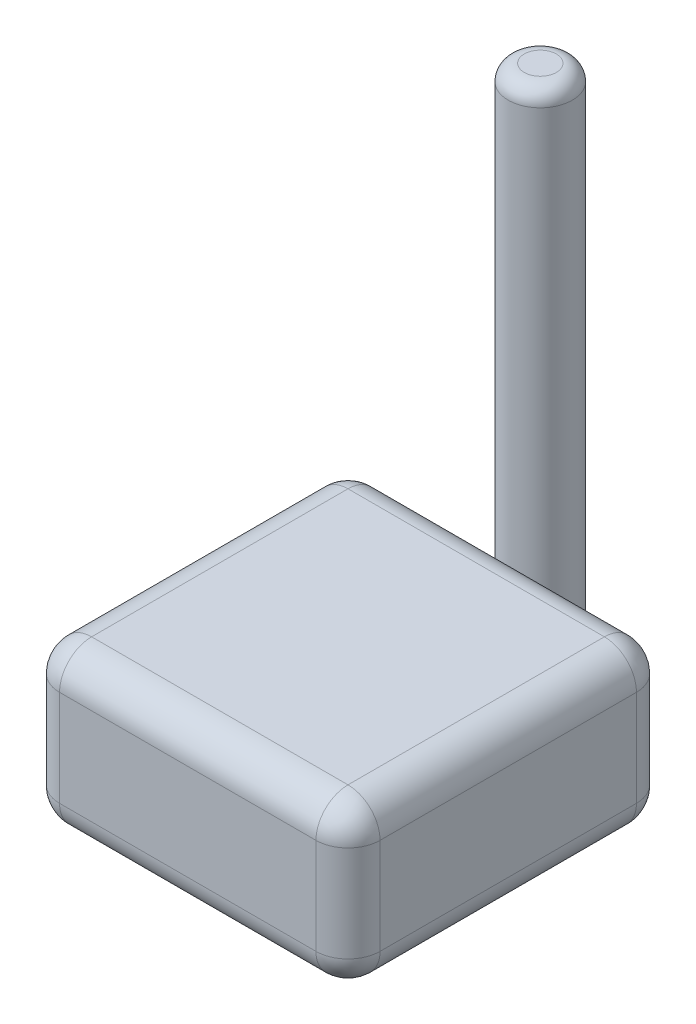
ISO-10303-21;
HEADER;
FILE_DESCRIPTION(('STEP AP214'),'2;1');
FILE_NAME('part.step','',(''),(''),'','','');
FILE_SCHEMA(('AUTOMOTIVE_DESIGN { 1 0 10303 214 1 1 1 1 }'));
ENDSEC;
DATA;
#1=APPLICATION_CONTEXT('core data for automotive mechanical design processes');
#2=APPLICATION_PROTOCOL_DEFINITION('international standard','automotive_design',2000,#1);
#3=PRODUCT_CONTEXT('',#1,'mechanical');
#4=PRODUCT('Part','Part','',(#3));
#5=PRODUCT_RELATED_PRODUCT_CATEGORY('part','',(#4));
#6=PRODUCT_DEFINITION_FORMATION('','',#4);
#7=PRODUCT_DEFINITION_CONTEXT('part definition',#1,'design');
#8=PRODUCT_DEFINITION('design','',#6,#7);
#9=PRODUCT_DEFINITION_SHAPE('','',#8);
#10=(LENGTH_UNIT() NAMED_UNIT(*) SI_UNIT(.MILLI.,.METRE.));
#11=(NAMED_UNIT(*) PLANE_ANGLE_UNIT() SI_UNIT($,.RADIAN.));
#12=(NAMED_UNIT(*) SI_UNIT($,.STERADIAN.) SOLID_ANGLE_UNIT());
#13=UNCERTAINTY_MEASURE_WITH_UNIT(LENGTH_MEASURE(1.E-05),#10,'distance_accuracy_value','');
#14=(GEOMETRIC_REPRESENTATION_CONTEXT(3) GLOBAL_UNCERTAINTY_ASSIGNED_CONTEXT((#13)) GLOBAL_UNIT_ASSIGNED_CONTEXT((#10,
#11,#12)) REPRESENTATION_CONTEXT('',''));
#15=CARTESIAN_POINT('',(0.,0.,0.));
#16=DIRECTION('',(0.,0.,1.));
#17=DIRECTION('',(1.,0.,0.));
#18=AXIS2_PLACEMENT_3D('',#15,#16,#17);
#19=CARTESIAN_POINT('',(-51.4264347774672,45.4042811347466,-12.));
#20=DIRECTION('',(0.,-1.,0.));
#21=DIRECTION('',(1.,0.,0.));
#22=AXIS2_PLACEMENT_3D('',#19,#20,#21);
#23=CYLINDRICAL_SURFACE('',#22,2.);
#24=CARTESIAN_POINT('',(-51.4264347774672,44.4042811347466,-12.));
#25=DIRECTION('',(0.,1.,0.));
#26=DIRECTION('',(-1.,0.,0.));
#27=AXIS2_PLACEMENT_3D('',#24,#25,#26);
#28=CIRCLE('',#27,2.);
#29=CARTESIAN_POINT('',(-53.4264347774672,44.4042811347466,-12.));
#30=VERTEX_POINT('',#29);
#31=EDGE_CURVE('E11',#30,#30,#28,.F.);
#32=ORIENTED_EDGE('',*,*,#31,.T.);
#33=EDGE_LOOP('',(#32));
#34=FACE_BOUND('',#33,.T.);
#35=CARTESIAN_POINT('',(-51.4264347774672,15.4042811347466,-12.));
#36=DIRECTION('',(0.,1.,0.));
#37=DIRECTION('',(-1.,0.,0.));
#38=AXIS2_PLACEMENT_3D('',#35,#36,#37);
#39=CIRCLE('',#38,2.);
#40=CARTESIAN_POINT('',(-53.4264347774672,15.4042811347466,-12.));
#41=VERTEX_POINT('',#40);
#42=EDGE_CURVE('E59',#41,#41,#39,.T.);
#43=ORIENTED_EDGE('',*,*,#42,.T.);
#44=EDGE_LOOP('',(#43));
#45=FACE_BOUND('',#44,.T.);
#46=ADVANCED_FACE('F50',(#34,#45),#23,.T.);
#47=CARTESIAN_POINT('',(-51.4264347774672,45.4042811347466,-12.));
#48=DIRECTION('',(0.,1.,0.));
#49=DIRECTION('',(-1.,0.,0.));
#50=AXIS2_PLACEMENT_3D('',#47,#48,#49);
#51=PLANE('',#50);
#52=CARTESIAN_POINT('',(-51.4264347774672,45.4042811347466,-12.));
#53=DIRECTION('',(0.,1.,0.));
#54=DIRECTION('',(-1.,0.,0.));
#55=AXIS2_PLACEMENT_3D('',#52,#53,#54);
#56=CIRCLE('',#55,1.);
#57=CARTESIAN_POINT('',(-52.4264347774672,45.4042811347466,-12.));
#58=VERTEX_POINT('',#57);
#59=EDGE_CURVE('E53',#58,#58,#56,.T.);
#60=ORIENTED_EDGE('',*,*,#59,.T.);
#61=EDGE_LOOP('',(#60));
#62=FACE_BOUND('',#61,.T.);
#63=ADVANCED_FACE('F70',(#62),#51,.T.);
#64=CARTESIAN_POINT('',(-51.4264347774672,15.4042811347466,-12.));
#65=DIRECTION('',(0.,1.,0.));
#66=DIRECTION('',(-1.,0.,0.));
#67=AXIS2_PLACEMENT_3D('',#64,#65,#66);
#68=PLANE('',#67);
#69=ORIENTED_EDGE('',*,*,#42,.F.);
#70=EDGE_LOOP('',(#69));
#71=FACE_BOUND('',#70,.T.);
#72=ADVANCED_FACE('F69',(#71),#68,.F.);
#73=CARTESIAN_POINT('',(-51.4264347774672,44.4042811347466,-12.));
#74=DIRECTION('',(0.,1.,0.));
#75=DIRECTION('',(-1.,0.,0.));
#76=AXIS2_PLACEMENT_3D('',#73,#74,#75);
#77=TOROIDAL_SURFACE('',#76,1.,1.);
#78=ORIENTED_EDGE('',*,*,#31,.F.);
#79=EDGE_LOOP('',(#78));
#80=FACE_BOUND('',#79,.T.);
#81=ORIENTED_EDGE('',*,*,#59,.F.);
#82=EDGE_LOOP('',(#81));
#83=FACE_BOUND('',#82,.T.);
#84=ADVANCED_FACE('F47',(#80,#83),#77,.T.);
#85=CLOSED_SHELL('',(#46,#63,#72,#84));
#86=MANIFOLD_SOLID_BREP('B2',#85);
#87=CARTESIAN_POINT('',(-41.4264347774672,10.4042811347466,10.));
#88=DIRECTION('',(-1.,0.,0.));
#89=DIRECTION('',(0.,0.,1.));
#90=AXIS2_PLACEMENT_3D('',#87,#88,#89);
#91=PLANE('',#90);
#92=DIRECTION('',(0.,0.,-1.));
#93=VECTOR('',#92,1.);
#94=CARTESIAN_POINT('',(-41.4264347774672,12.4042811347466,10.));
#95=LINE('',#94,#93);
#96=CARTESIAN_POINT('',(-41.4264347774672,12.4042811347466,8.));
#97=VERTEX_POINT('',#96);
#98=CARTESIAN_POINT('',(-41.4264347774672,12.4042811347466,-8.));
#99=VERTEX_POINT('',#98);
#100=EDGE_CURVE('E227',#97,#99,#95,.T.);
#101=ORIENTED_EDGE('',*,*,#100,.T.);
#102=DIRECTION('',(0.,1.,0.));
#103=VECTOR('',#102,1.);
#104=CARTESIAN_POINT('',(-41.4264347774672,20.4042811347466,-8.));
#105=LINE('',#104,#103);
#106=CARTESIAN_POINT('',(-41.4264347774672,18.4042811347466,-8.));
#107=VERTEX_POINT('',#106);
#108=EDGE_CURVE('E315',#99,#107,#105,.T.);
#109=ORIENTED_EDGE('',*,*,#108,.T.);
#110=DIRECTION('',(0.,0.,-1.));
#111=VECTOR('',#110,1.);
#112=CARTESIAN_POINT('',(-41.4264347774672,18.4042811347466,10.));
#113=LINE('',#112,#111);
#114=CARTESIAN_POINT('',(-41.4264347774672,18.4042811347466,8.));
#115=VERTEX_POINT('',#114);
#116=EDGE_CURVE('E307',#107,#115,#113,.F.);
#117=ORIENTED_EDGE('',*,*,#116,.T.);
#118=DIRECTION('',(0.,1.,0.));
#119=VECTOR('',#118,1.);
#120=CARTESIAN_POINT('',(-41.4264347774672,10.4042811347466,8.));
#121=LINE('',#120,#119);
#122=EDGE_CURVE('E310',#115,#97,#121,.F.);
#123=ORIENTED_EDGE('',*,*,#122,.T.);
#124=EDGE_LOOP('',(#101,#109,#117,#123));
#125=FACE_BOUND('',#124,.T.);
#126=ADVANCED_FACE('F103',(#125),#91,.F.);
#127=CARTESIAN_POINT('',(-61.4264347774672,20.4042811347466,10.));
#128=DIRECTION('',(0.,-1.,0.));
#129=DIRECTION('',(0.,0.,-1.));
#130=AXIS2_PLACEMENT_3D('',#127,#128,#129);
#131=PLANE('',#130);
#132=DIRECTION('',(0.,0.,-1.));
#133=VECTOR('',#132,1.);
#134=CARTESIAN_POINT('',(-43.4264347774672,20.4042811347466,10.));
#135=LINE('',#134,#133);
#136=CARTESIAN_POINT('',(-43.4264347774672,20.4042811347466,8.));
#137=VERTEX_POINT('',#136);
#138=CARTESIAN_POINT('',(-43.4264347774672,20.4042811347466,-8.));
#139=VERTEX_POINT('',#138);
#140=EDGE_CURVE('E312',#137,#139,#135,.T.);
#141=ORIENTED_EDGE('',*,*,#140,.T.);
#142=DIRECTION('',(-1.,0.,0.));
#143=VECTOR('',#142,1.);
#144=CARTESIAN_POINT('',(-61.4264347774672,20.4042811347466,-8.));
#145=LINE('',#144,#143);
#146=CARTESIAN_POINT('',(-59.4264347774671,20.4042811347466,-8.));
#147=VERTEX_POINT('',#146);
#148=EDGE_CURVE('E44',#139,#147,#145,.T.);
#149=ORIENTED_EDGE('',*,*,#148,.T.);
#150=DIRECTION('',(0.,0.,-1.));
#151=VECTOR('',#150,1.);
#152=CARTESIAN_POINT('',(-59.4264347774671,20.4042811347466,10.));
#153=LINE('',#152,#151);
#154=CARTESIAN_POINT('',(-59.4264347774671,20.4042811347466,8.));
#155=VERTEX_POINT('',#154);
#156=EDGE_CURVE('E115',#147,#155,#153,.F.);
#157=ORIENTED_EDGE('',*,*,#156,.T.);
#158=DIRECTION('',(-1.,0.,0.));
#159=VECTOR('',#158,1.);
#160=CARTESIAN_POINT('',(-61.4264347774672,20.4042811347466,8.));
#161=LINE('',#160,#159);
#162=EDGE_CURVE('E320',#155,#137,#161,.F.);
#163=ORIENTED_EDGE('',*,*,#162,.T.);
#164=EDGE_LOOP('',(#141,#149,#157,#163));
#165=FACE_BOUND('',#164,.T.);
#166=ADVANCED_FACE('F375',(#165),#131,.F.);
#167=CARTESIAN_POINT('',(-61.4264347774672,10.4042811347466,10.));
#168=DIRECTION('',(1.,0.,0.));
#169=DIRECTION('',(0.,1.,0.));
#170=AXIS2_PLACEMENT_3D('',#167,#168,#169);
#171=PLANE('',#170);
#172=DIRECTION('',(0.,0.,-1.));
#173=VECTOR('',#172,1.);
#174=CARTESIAN_POINT('',(-61.4264347774672,18.4042811347466,10.));
#175=LINE('',#174,#173);
#176=CARTESIAN_POINT('',(-61.4264347774672,18.4042811347466,8.));
#177=VERTEX_POINT('',#176);
#178=CARTESIAN_POINT('',(-61.4264347774672,18.4042811347466,-8.));
#179=VERTEX_POINT('',#178);
#180=EDGE_CURVE('E284',#177,#179,#175,.T.);
#181=ORIENTED_EDGE('',*,*,#180,.T.);
#182=DIRECTION('',(0.,-1.,0.));
#183=VECTOR('',#182,1.);
#184=CARTESIAN_POINT('',(-61.4264347774672,10.4042811347466,-8.));
#185=LINE('',#184,#183);
#186=CARTESIAN_POINT('',(-61.4264347774672,12.4042811347466,-8.));
#187=VERTEX_POINT('',#186);
#188=EDGE_CURVE('E297',#179,#187,#185,.T.);
#189=ORIENTED_EDGE('',*,*,#188,.T.);
#190=DIRECTION('',(0.,0.,-1.));
#191=VECTOR('',#190,1.);
#192=CARTESIAN_POINT('',(-61.4264347774672,12.4042811347466,10.));
#193=LINE('',#192,#191);
#194=CARTESIAN_POINT('',(-61.4264347774672,12.4042811347466,8.));
#195=VERTEX_POINT('',#194);
#196=EDGE_CURVE('E290',#187,#195,#193,.F.);
#197=ORIENTED_EDGE('',*,*,#196,.T.);
#198=DIRECTION('',(0.,-1.,0.));
#199=VECTOR('',#198,1.);
#200=CARTESIAN_POINT('',(-61.4264347774672,10.4042811347466,8.));
#201=LINE('',#200,#199);
#202=EDGE_CURVE('E283',#195,#177,#201,.F.);
#203=ORIENTED_EDGE('',*,*,#202,.T.);
#204=EDGE_LOOP('',(#181,#189,#197,#203));
#205=FACE_BOUND('',#204,.T.);
#206=ADVANCED_FACE('F378',(#205),#171,.F.);
#207=CARTESIAN_POINT('',(-61.4264347774672,10.4042811347466,10.));
#208=DIRECTION('',(0.,1.,0.));
#209=DIRECTION('',(-1.,0.,0.));
#210=AXIS2_PLACEMENT_3D('',#207,#208,#209);
#211=PLANE('',#210);
#212=DIRECTION('',(0.,0.,-1.));
#213=VECTOR('',#212,1.);
#214=CARTESIAN_POINT('',(-59.4264347774672,10.4042811347466,10.));
#215=LINE('',#214,#213);
#216=CARTESIAN_POINT('',(-59.4264347774672,10.4042811347466,8.));
#217=VERTEX_POINT('',#216);
#218=CARTESIAN_POINT('',(-59.4264347774672,10.4042811347466,-8.));
#219=VERTEX_POINT('',#218);
#220=EDGE_CURVE('E202',#217,#219,#215,.T.);
#221=ORIENTED_EDGE('',*,*,#220,.T.);
#222=DIRECTION('',(1.,0.,0.));
#223=VECTOR('',#222,1.);
#224=CARTESIAN_POINT('',(-41.4264347774672,10.4042811347466,-8.));
#225=LINE('',#224,#223);
#226=CARTESIAN_POINT('',(-43.4264347774672,10.4042811347466,-8.));
#227=VERTEX_POINT('',#226);
#228=EDGE_CURVE('E203',#219,#227,#225,.T.);
#229=ORIENTED_EDGE('',*,*,#228,.T.);
#230=DIRECTION('',(0.,0.,-1.));
#231=VECTOR('',#230,1.);
#232=CARTESIAN_POINT('',(-43.4264347774672,10.4042811347466,10.));
#233=LINE('',#232,#231);
#234=CARTESIAN_POINT('',(-43.4264347774672,10.4042811347466,8.));
#235=VERTEX_POINT('',#234);
#236=EDGE_CURVE('E192',#227,#235,#233,.F.);
#237=ORIENTED_EDGE('',*,*,#236,.T.);
#238=DIRECTION('',(1.,0.,0.));
#239=VECTOR('',#238,1.);
#240=CARTESIAN_POINT('',(-61.4264347774672,10.4042811347466,8.));
#241=LINE('',#240,#239);
#242=EDGE_CURVE('E196',#235,#217,#241,.F.);
#243=ORIENTED_EDGE('',*,*,#242,.T.);
#244=EDGE_LOOP('',(#221,#229,#237,#243));
#245=FACE_BOUND('',#244,.T.);
#246=ADVANCED_FACE('F197',(#245),#211,.F.);
#247=CARTESIAN_POINT('',(0.,0.,10.));
#248=DIRECTION('',(0.,0.,-1.));
#249=DIRECTION('',(-1.,0.,0.));
#250=AXIS2_PLACEMENT_3D('',#247,#248,#249);
#251=PLANE('',#250);
#252=DIRECTION('',(-1.,0.,0.));
#253=VECTOR('',#252,1.);
#254=CARTESIAN_POINT('',(0.,18.4042811347466,10.));
#255=LINE('',#254,#253);
#256=CARTESIAN_POINT('',(-43.4264347774672,18.4042811347466,10.));
#257=VERTEX_POINT('',#256);
#258=CARTESIAN_POINT('',(-59.4264347774671,18.4042811347466,10.));
#259=VERTEX_POINT('',#258);
#260=EDGE_CURVE('E300',#257,#259,#255,.T.);
#261=ORIENTED_EDGE('',*,*,#260,.T.);
#262=DIRECTION('',(0.,-1.,0.));
#263=VECTOR('',#262,1.);
#264=CARTESIAN_POINT('',(-59.4264347774672,0.,10.));
#265=LINE('',#264,#263);
#266=CARTESIAN_POINT('',(-59.4264347774672,12.4042811347466,10.));
#267=VERTEX_POINT('',#266);
#268=EDGE_CURVE('E303',#259,#267,#265,.T.);
#269=ORIENTED_EDGE('',*,*,#268,.T.);
#270=DIRECTION('',(1.,0.,0.));
#271=VECTOR('',#270,1.);
#272=CARTESIAN_POINT('',(0.,12.4042811347466,10.));
#273=LINE('',#272,#271);
#274=CARTESIAN_POINT('',(-43.4264347774672,12.4042811347466,10.));
#275=VERTEX_POINT('',#274);
#276=EDGE_CURVE('E301',#267,#275,#273,.T.);
#277=ORIENTED_EDGE('',*,*,#276,.T.);
#278=DIRECTION('',(0.,1.,0.));
#279=VECTOR('',#278,1.);
#280=CARTESIAN_POINT('',(-43.4264347774672,0.,10.));
#281=LINE('',#280,#279);
#282=EDGE_CURVE('E298',#275,#257,#281,.T.);
#283=ORIENTED_EDGE('',*,*,#282,.T.);
#284=EDGE_LOOP('',(#261,#269,#277,#283));
#285=FACE_BOUND('',#284,.T.);
#286=ADVANCED_FACE('F364',(#285),#251,.F.);
#287=CARTESIAN_POINT('',(0.,0.,-10.));
#288=DIRECTION('',(0.,0.,-1.));
#289=DIRECTION('',(-1.,0.,0.));
#290=AXIS2_PLACEMENT_3D('',#287,#288,#289);
#291=PLANE('',#290);
#292=DIRECTION('',(0.,1.,0.));
#293=VECTOR('',#292,1.);
#294=CARTESIAN_POINT('',(-43.4264347774672,10.4042811347466,-10.));
#295=LINE('',#294,#293);
#296=CARTESIAN_POINT('',(-43.4264347774672,18.4042811347466,-10.));
#297=VERTEX_POINT('',#296);
#298=CARTESIAN_POINT('',(-43.4264347774672,12.4042811347466,-10.));
#299=VERTEX_POINT('',#298);
#300=EDGE_CURVE('E343',#297,#299,#295,.F.);
#301=ORIENTED_EDGE('',*,*,#300,.T.);
#302=DIRECTION('',(1.,0.,0.));
#303=VECTOR('',#302,1.);
#304=CARTESIAN_POINT('',(-61.4264347774672,12.4042811347466,-10.));
#305=LINE('',#304,#303);
#306=CARTESIAN_POINT('',(-59.4264347774672,12.4042811347466,-10.));
#307=VERTEX_POINT('',#306);
#308=EDGE_CURVE('E289',#299,#307,#305,.F.);
#309=ORIENTED_EDGE('',*,*,#308,.T.);
#310=DIRECTION('',(0.,-1.,0.));
#311=VECTOR('',#310,1.);
#312=CARTESIAN_POINT('',(-59.4264347774671,20.4042811347466,-10.));
#313=LINE('',#312,#311);
#314=CARTESIAN_POINT('',(-59.4264347774671,18.4042811347466,-10.));
#315=VERTEX_POINT('',#314);
#316=EDGE_CURVE('E292',#307,#315,#313,.F.);
#317=ORIENTED_EDGE('',*,*,#316,.T.);
#318=DIRECTION('',(-1.,0.,0.));
#319=VECTOR('',#318,1.);
#320=CARTESIAN_POINT('',(-41.4264347774672,18.4042811347466,-10.));
#321=LINE('',#320,#319);
#322=EDGE_CURVE('E376',#315,#297,#321,.F.);
#323=ORIENTED_EDGE('',*,*,#322,.T.);
#324=EDGE_LOOP('',(#301,#309,#317,#323));
#325=FACE_BOUND('',#324,.T.);
#326=ADVANCED_FACE('F347',(#325),#291,.T.);
#327=CARTESIAN_POINT('',(0.,18.4042811347466,8.));
#328=DIRECTION('',(-1.,0.,0.));
#329=DIRECTION('',(0.,0.,1.));
#330=AXIS2_PLACEMENT_3D('',#327,#328,#329);
#331=CYLINDRICAL_SURFACE('',#330,2.);
#332=CARTESIAN_POINT('',(-59.4264347774671,18.4042811347466,8.));
#333=DIRECTION('',(-1.,0.,0.));
#334=DIRECTION('',(0.,0.,1.));
#335=AXIS2_PLACEMENT_3D('',#332,#333,#334);
#336=CIRCLE('',#335,2.);
#337=EDGE_CURVE('E110',#259,#155,#336,.T.);
#338=ORIENTED_EDGE('',*,*,#337,.F.);
#339=ORIENTED_EDGE('',*,*,#260,.F.);
#340=CARTESIAN_POINT('',(-43.4264347774672,18.4042811347466,8.));
#341=DIRECTION('',(1.,0.,0.));
#342=DIRECTION('',(0.,0.,-1.));
#343=AXIS2_PLACEMENT_3D('',#340,#341,#342);
#344=CIRCLE('',#343,2.);
#345=EDGE_CURVE('E262',#137,#257,#344,.T.);
#346=ORIENTED_EDGE('',*,*,#345,.F.);
#347=ORIENTED_EDGE('',*,*,#162,.F.);
#348=EDGE_LOOP('',(#338,#339,#346,#347));
#349=FACE_BOUND('',#348,.T.);
#350=ADVANCED_FACE('F104',(#349),#331,.T.);
#351=CARTESIAN_POINT('',(-59.4264347774671,18.4042811347466,8.));
#352=DIRECTION('',(0.,1.,0.));
#353=DIRECTION('',(0.,0.,1.));
#354=AXIS2_PLACEMENT_3D('',#351,#352,#353);
#355=SPHERICAL_SURFACE('',#354,2.);
#356=CARTESIAN_POINT('',(-59.4264347774671,18.4042811347466,8.));
#357=DIRECTION('',(0.,1.,0.));
#358=DIRECTION('',(0.,0.,1.));
#359=AXIS2_PLACEMENT_3D('',#356,#357,#358);
#360=CIRCLE('',#359,2.);
#361=EDGE_CURVE('E259',#259,#177,#360,.F.);
#362=ORIENTED_EDGE('',*,*,#361,.F.);
#363=ORIENTED_EDGE('',*,*,#337,.T.);
#364=CARTESIAN_POINT('',(-59.4264347774671,18.4042811347466,8.));
#365=DIRECTION('',(0.,0.,1.));
#366=DIRECTION('',(1.,0.,0.));
#367=AXIS2_PLACEMENT_3D('',#364,#365,#366);
#368=CIRCLE('',#367,2.);
#369=EDGE_CURVE('E265',#177,#155,#368,.F.);
#370=ORIENTED_EDGE('',*,*,#369,.F.);
#371=EDGE_LOOP('',(#362,#363,#370));
#372=FACE_BOUND('',#371,.T.);
#373=ADVANCED_FACE('F274',(#372),#355,.T.);
#374=CARTESIAN_POINT('',(-43.4264347774672,18.4042811347466,8.));
#375=DIRECTION('',(0.,0.,1.));
#376=DIRECTION('',(1.,0.,0.));
#377=AXIS2_PLACEMENT_3D('',#374,#375,#376);
#378=SPHERICAL_SURFACE('',#377,2.);
#379=CARTESIAN_POINT('',(-43.4264347774672,18.4042811347466,8.));
#380=DIRECTION('',(0.,0.,1.));
#381=DIRECTION('',(1.,0.,0.));
#382=AXIS2_PLACEMENT_3D('',#379,#380,#381);
#383=CIRCLE('',#382,2.);
#384=EDGE_CURVE('E251',#137,#115,#383,.F.);
#385=ORIENTED_EDGE('',*,*,#384,.F.);
#386=ORIENTED_EDGE('',*,*,#345,.T.);
#387=CARTESIAN_POINT('',(-43.4264347774672,18.4042811347466,8.));
#388=DIRECTION('',(0.,1.,0.));
#389=DIRECTION('',(0.,0.,1.));
#390=AXIS2_PLACEMENT_3D('',#387,#388,#389);
#391=CIRCLE('',#390,2.);
#392=EDGE_CURVE('E258',#115,#257,#391,.F.);
#393=ORIENTED_EDGE('',*,*,#392,.F.);
#394=EDGE_LOOP('',(#385,#386,#393));
#395=FACE_BOUND('',#394,.T.);
#396=ADVANCED_FACE('F370',(#395),#378,.T.);
#397=CARTESIAN_POINT('',(-59.4264347774671,18.4042811347466,10.));
#398=DIRECTION('',(0.,0.,-1.));
#399=DIRECTION('',(-1.,0.,0.));
#400=AXIS2_PLACEMENT_3D('',#397,#398,#399);
#401=CYLINDRICAL_SURFACE('',#400,2.);
#402=ORIENTED_EDGE('',*,*,#369,.T.);
#403=ORIENTED_EDGE('',*,*,#156,.F.);
#404=CARTESIAN_POINT('',(-59.4264347774671,18.4042811347466,-8.));
#405=DIRECTION('',(0.,0.,-1.));
#406=DIRECTION('',(-1.,0.,0.));
#407=AXIS2_PLACEMENT_3D('',#404,#405,#406);
#408=CIRCLE('',#407,2.);
#409=EDGE_CURVE('E118',#179,#147,#408,.T.);
#410=ORIENTED_EDGE('',*,*,#409,.F.);
#411=ORIENTED_EDGE('',*,*,#180,.F.);
#412=EDGE_LOOP('',(#402,#403,#410,#411));
#413=FACE_BOUND('',#412,.T.);
#414=ADVANCED_FACE('F282',(#413),#401,.T.);
#415=CARTESIAN_POINT('',(-59.4264347774672,0.,8.));
#416=DIRECTION('',(0.,-1.,0.));
#417=DIRECTION('',(1.,0.,0.));
#418=AXIS2_PLACEMENT_3D('',#415,#416,#417);
#419=CYLINDRICAL_SURFACE('',#418,2.);
#420=ORIENTED_EDGE('',*,*,#361,.T.);
#421=ORIENTED_EDGE('',*,*,#202,.F.);
#422=CARTESIAN_POINT('',(-59.4264347774672,12.4042811347466,8.));
#423=DIRECTION('',(0.,-1.,0.));
#424=DIRECTION('',(1.,0.,0.));
#425=AXIS2_PLACEMENT_3D('',#422,#423,#424);
#426=CIRCLE('',#425,2.);
#427=EDGE_CURVE('E246',#267,#195,#426,.T.);
#428=ORIENTED_EDGE('',*,*,#427,.F.);
#429=ORIENTED_EDGE('',*,*,#268,.F.);
#430=EDGE_LOOP('',(#420,#421,#428,#429));
#431=FACE_BOUND('',#430,.T.);
#432=ADVANCED_FACE('F382',(#431),#419,.T.);
#433=CARTESIAN_POINT('',(0.,12.4042811347466,8.));
#434=DIRECTION('',(1.,0.,0.));
#435=DIRECTION('',(0.,1.,0.));
#436=AXIS2_PLACEMENT_3D('',#433,#434,#435);
#437=CYLINDRICAL_SURFACE('',#436,2.);
#438=CARTESIAN_POINT('',(-43.4264347774672,12.4042811347466,8.));
#439=DIRECTION('',(1.,0.,0.));
#440=DIRECTION('',(0.,0.,-1.));
#441=AXIS2_PLACEMENT_3D('',#438,#439,#440);
#442=CIRCLE('',#441,2.);
#443=EDGE_CURVE('E215',#275,#235,#442,.T.);
#444=ORIENTED_EDGE('',*,*,#443,.F.);
#445=ORIENTED_EDGE('',*,*,#276,.F.);
#446=CARTESIAN_POINT('',(-59.4264347774672,12.4042811347466,8.));
#447=DIRECTION('',(-1.,0.,0.));
#448=DIRECTION('',(0.,0.,1.));
#449=AXIS2_PLACEMENT_3D('',#446,#447,#448);
#450=CIRCLE('',#449,2.);
#451=EDGE_CURVE('E212',#217,#267,#450,.T.);
#452=ORIENTED_EDGE('',*,*,#451,.F.);
#453=ORIENTED_EDGE('',*,*,#242,.F.);
#454=EDGE_LOOP('',(#444,#445,#452,#453));
#455=FACE_BOUND('',#454,.T.);
#456=ADVANCED_FACE('F209',(#455),#437,.T.);
#457=CARTESIAN_POINT('',(-43.4264347774672,0.,8.));
#458=DIRECTION('',(0.,1.,0.));
#459=DIRECTION('',(0.,0.,1.));
#460=AXIS2_PLACEMENT_3D('',#457,#458,#459);
#461=CYLINDRICAL_SURFACE('',#460,2.);
#462=ORIENTED_EDGE('',*,*,#392,.T.);
#463=ORIENTED_EDGE('',*,*,#282,.F.);
#464=CARTESIAN_POINT('',(-43.4264347774672,12.4042811347466,8.));
#465=DIRECTION('',(0.,-1.,0.));
#466=DIRECTION('',(0.,0.,-1.));
#467=AXIS2_PLACEMENT_3D('',#464,#465,#466);
#468=CIRCLE('',#467,2.);
#469=EDGE_CURVE('E224',#97,#275,#468,.T.);
#470=ORIENTED_EDGE('',*,*,#469,.F.);
#471=ORIENTED_EDGE('',*,*,#122,.F.);
#472=EDGE_LOOP('',(#462,#463,#470,#471));
#473=FACE_BOUND('',#472,.T.);
#474=ADVANCED_FACE('F361',(#473),#461,.T.);
#475=CARTESIAN_POINT('',(-43.4264347774672,18.4042811347466,10.));
#476=DIRECTION('',(0.,0.,-1.));
#477=DIRECTION('',(-1.,0.,0.));
#478=AXIS2_PLACEMENT_3D('',#475,#476,#477);
#479=CYLINDRICAL_SURFACE('',#478,2.);
#480=ORIENTED_EDGE('',*,*,#384,.T.);
#481=ORIENTED_EDGE('',*,*,#116,.F.);
#482=CARTESIAN_POINT('',(-43.4264347774672,18.4042811347466,-8.));
#483=DIRECTION('',(0.,0.,-1.));
#484=DIRECTION('',(-1.,0.,0.));
#485=AXIS2_PLACEMENT_3D('',#482,#483,#484);
#486=CIRCLE('',#485,2.);
#487=EDGE_CURVE('E244',#139,#107,#486,.T.);
#488=ORIENTED_EDGE('',*,*,#487,.F.);
#489=ORIENTED_EDGE('',*,*,#140,.F.);
#490=EDGE_LOOP('',(#480,#481,#488,#489));
#491=FACE_BOUND('',#490,.T.);
#492=ADVANCED_FACE('F367',(#491),#479,.T.);
#493=CARTESIAN_POINT('',(-61.4264347774672,18.4042811347466,-8.));
#494=DIRECTION('',(1.,0.,0.));
#495=DIRECTION('',(0.,0.,-1.));
#496=AXIS2_PLACEMENT_3D('',#493,#494,#495);
#497=CYLINDRICAL_SURFACE('',#496,2.);
#498=CARTESIAN_POINT('',(-59.4264347774671,18.4042811347466,-8.));
#499=DIRECTION('',(-1.,0.,0.));
#500=DIRECTION('',(0.,0.,1.));
#501=AXIS2_PLACEMENT_3D('',#498,#499,#500);
#502=CIRCLE('',#501,2.);
#503=EDGE_CURVE('E253',#147,#315,#502,.T.);
#504=ORIENTED_EDGE('',*,*,#503,.F.);
#505=ORIENTED_EDGE('',*,*,#148,.F.);
#506=CARTESIAN_POINT('',(-43.4264347774672,18.4042811347466,-8.));
#507=DIRECTION('',(1.,0.,0.));
#508=DIRECTION('',(0.,0.,-1.));
#509=AXIS2_PLACEMENT_3D('',#506,#507,#508);
#510=CIRCLE('',#509,2.);
#511=EDGE_CURVE('E239',#297,#139,#510,.T.);
#512=ORIENTED_EDGE('',*,*,#511,.F.);
#513=ORIENTED_EDGE('',*,*,#322,.F.);
#514=EDGE_LOOP('',(#504,#505,#512,#513));
#515=FACE_BOUND('',#514,.T.);
#516=ADVANCED_FACE('F374',(#515),#497,.T.);
#517=CARTESIAN_POINT('',(-59.4264347774671,18.4042811347466,-8.));
#518=DIRECTION('',(0.,1.,0.));
#519=DIRECTION('',(0.,0.,1.));
#520=AXIS2_PLACEMENT_3D('',#517,#518,#519);
#521=SPHERICAL_SURFACE('',#520,2.);
#522=ORIENTED_EDGE('',*,*,#409,.T.);
#523=ORIENTED_EDGE('',*,*,#503,.T.);
#524=CARTESIAN_POINT('',(-59.4264347774671,18.4042811347466,-8.));
#525=DIRECTION('',(0.,1.,0.));
#526=DIRECTION('',(0.,0.,1.));
#527=AXIS2_PLACEMENT_3D('',#524,#525,#526);
#528=CIRCLE('',#527,2.);
#529=EDGE_CURVE('E234',#179,#315,#528,.F.);
#530=ORIENTED_EDGE('',*,*,#529,.F.);
#531=EDGE_LOOP('',(#522,#523,#530));
#532=FACE_BOUND('',#531,.T.);
#533=ADVANCED_FACE('F380',(#532),#521,.T.);
#534=CARTESIAN_POINT('',(-59.4264347774672,12.4042811347466,8.));
#535=DIRECTION('',(0.,0.,1.));
#536=DIRECTION('',(1.,0.,0.));
#537=AXIS2_PLACEMENT_3D('',#534,#535,#536);
#538=SPHERICAL_SURFACE('',#537,2.);
#539=ORIENTED_EDGE('',*,*,#451,.T.);
#540=ORIENTED_EDGE('',*,*,#427,.T.);
#541=CARTESIAN_POINT('',(-59.4264347774672,12.4042811347466,8.));
#542=DIRECTION('',(0.,0.,1.));
#543=DIRECTION('',(1.,0.,0.));
#544=AXIS2_PLACEMENT_3D('',#541,#542,#543);
#545=CIRCLE('',#544,2.);
#546=EDGE_CURVE('E229',#217,#195,#545,.F.);
#547=ORIENTED_EDGE('',*,*,#546,.F.);
#548=EDGE_LOOP('',(#539,#540,#547));
#549=FACE_BOUND('',#548,.T.);
#550=ADVANCED_FACE('F384',(#549),#538,.T.);
#551=CARTESIAN_POINT('',(-43.4264347774672,12.4042811347466,8.));
#552=DIRECTION('',(0.,0.,1.));
#553=DIRECTION('',(1.,0.,0.));
#554=AXIS2_PLACEMENT_3D('',#551,#552,#553);
#555=SPHERICAL_SURFACE('',#554,2.);
#556=ORIENTED_EDGE('',*,*,#469,.T.);
#557=ORIENTED_EDGE('',*,*,#443,.T.);
#558=CARTESIAN_POINT('',(-43.4264347774672,12.4042811347466,8.));
#559=DIRECTION('',(0.,0.,1.));
#560=DIRECTION('',(1.,0.,0.));
#561=AXIS2_PLACEMENT_3D('',#558,#559,#560);
#562=CIRCLE('',#561,2.);
#563=EDGE_CURVE('E219',#97,#235,#562,.F.);
#564=ORIENTED_EDGE('',*,*,#563,.F.);
#565=EDGE_LOOP('',(#556,#557,#564));
#566=FACE_BOUND('',#565,.T.);
#567=ADVANCED_FACE('F218',(#566),#555,.T.);
#568=CARTESIAN_POINT('',(-43.4264347774672,18.4042811347466,-8.));
#569=DIRECTION('',(0.,1.,0.));
#570=DIRECTION('',(0.,0.,1.));
#571=AXIS2_PLACEMENT_3D('',#568,#569,#570);
#572=SPHERICAL_SURFACE('',#571,2.);
#573=ORIENTED_EDGE('',*,*,#511,.T.);
#574=ORIENTED_EDGE('',*,*,#487,.T.);
#575=CARTESIAN_POINT('',(-43.4264347774672,18.4042811347466,-8.));
#576=DIRECTION('',(0.,1.,0.));
#577=DIRECTION('',(0.,0.,1.));
#578=AXIS2_PLACEMENT_3D('',#575,#576,#577);
#579=CIRCLE('',#578,2.);
#580=EDGE_CURVE('E230',#297,#107,#579,.F.);
#581=ORIENTED_EDGE('',*,*,#580,.F.);
#582=EDGE_LOOP('',(#573,#574,#581));
#583=FACE_BOUND('',#582,.T.);
#584=ADVANCED_FACE('F398',(#583),#572,.T.);
#585=CARTESIAN_POINT('',(-59.4264347774672,10.4042811347466,-8.));
#586=DIRECTION('',(0.,1.,0.));
#587=DIRECTION('',(-1.,0.,0.));
#588=AXIS2_PLACEMENT_3D('',#585,#586,#587);
#589=CYLINDRICAL_SURFACE('',#588,2.);
#590=ORIENTED_EDGE('',*,*,#529,.T.);
#591=ORIENTED_EDGE('',*,*,#316,.F.);
#592=CARTESIAN_POINT('',(-59.4264347774672,12.4042811347466,-8.));
#593=DIRECTION('',(0.,-1.,0.));
#594=DIRECTION('',(1.,0.,0.));
#595=AXIS2_PLACEMENT_3D('',#592,#593,#594);
#596=CIRCLE('',#595,2.);
#597=EDGE_CURVE('E235',#187,#307,#596,.T.);
#598=ORIENTED_EDGE('',*,*,#597,.F.);
#599=ORIENTED_EDGE('',*,*,#188,.F.);
#600=EDGE_LOOP('',(#590,#591,#598,#599));
#601=FACE_BOUND('',#600,.T.);
#602=ADVANCED_FACE('F344',(#601),#589,.T.);
#603=CARTESIAN_POINT('',(-59.4264347774672,12.4042811347466,10.));
#604=DIRECTION('',(0.,0.,-1.));
#605=DIRECTION('',(-1.,0.,0.));
#606=AXIS2_PLACEMENT_3D('',#603,#604,#605);
#607=CYLINDRICAL_SURFACE('',#606,2.);
#608=ORIENTED_EDGE('',*,*,#546,.T.);
#609=ORIENTED_EDGE('',*,*,#196,.F.);
#610=CARTESIAN_POINT('',(-59.4264347774672,12.4042811347466,-8.));
#611=DIRECTION('',(0.,0.,-1.));
#612=DIRECTION('',(-1.,0.,0.));
#613=AXIS2_PLACEMENT_3D('',#610,#611,#612);
#614=CIRCLE('',#613,2.);
#615=EDGE_CURVE('E329',#219,#187,#614,.T.);
#616=ORIENTED_EDGE('',*,*,#615,.F.);
#617=ORIENTED_EDGE('',*,*,#220,.F.);
#618=EDGE_LOOP('',(#608,#609,#616,#617));
#619=FACE_BOUND('',#618,.T.);
#620=ADVANCED_FACE('F390',(#619),#607,.T.);
#621=CARTESIAN_POINT('',(-43.4264347774672,12.4042811347466,10.));
#622=DIRECTION('',(0.,0.,-1.));
#623=DIRECTION('',(-1.,0.,0.));
#624=AXIS2_PLACEMENT_3D('',#621,#622,#623);
#625=CYLINDRICAL_SURFACE('',#624,2.);
#626=ORIENTED_EDGE('',*,*,#563,.T.);
#627=ORIENTED_EDGE('',*,*,#236,.F.);
#628=CARTESIAN_POINT('',(-43.4264347774672,12.4042811347466,-8.));
#629=DIRECTION('',(0.,0.,-1.));
#630=DIRECTION('',(-1.,0.,0.));
#631=AXIS2_PLACEMENT_3D('',#628,#629,#630);
#632=CIRCLE('',#631,2.);
#633=EDGE_CURVE('E330',#99,#227,#632,.T.);
#634=ORIENTED_EDGE('',*,*,#633,.F.);
#635=ORIENTED_EDGE('',*,*,#100,.F.);
#636=EDGE_LOOP('',(#626,#627,#634,#635));
#637=FACE_BOUND('',#636,.T.);
#638=ADVANCED_FACE('F223',(#637),#625,.T.);
#639=CARTESIAN_POINT('',(-43.4264347774672,10.4042811347466,-8.));
#640=DIRECTION('',(0.,-1.,0.));
#641=DIRECTION('',(0.,0.,-1.));
#642=AXIS2_PLACEMENT_3D('',#639,#640,#641);
#643=CYLINDRICAL_SURFACE('',#642,2.);
#644=ORIENTED_EDGE('',*,*,#580,.T.);
#645=ORIENTED_EDGE('',*,*,#108,.F.);
#646=CARTESIAN_POINT('',(-43.4264347774672,12.4042811347466,-8.));
#647=DIRECTION('',(0.,-1.,0.));
#648=DIRECTION('',(0.,0.,-1.));
#649=AXIS2_PLACEMENT_3D('',#646,#647,#648);
#650=CIRCLE('',#649,2.);
#651=EDGE_CURVE('E322',#299,#99,#650,.T.);
#652=ORIENTED_EDGE('',*,*,#651,.F.);
#653=ORIENTED_EDGE('',*,*,#300,.F.);
#654=EDGE_LOOP('',(#644,#645,#652,#653));
#655=FACE_BOUND('',#654,.T.);
#656=ADVANCED_FACE('F359',(#655),#643,.T.);
#657=CARTESIAN_POINT('',(-59.4264347774672,12.4042811347466,-8.));
#658=DIRECTION('',(-1.,0.,0.));
#659=DIRECTION('',(0.,0.,1.));
#660=AXIS2_PLACEMENT_3D('',#657,#658,#659);
#661=SPHERICAL_SURFACE('',#660,2.);
#662=ORIENTED_EDGE('',*,*,#615,.T.);
#663=ORIENTED_EDGE('',*,*,#597,.T.);
#664=CARTESIAN_POINT('',(-59.4264347774672,12.4042811347466,-8.));
#665=DIRECTION('',(-1.,0.,0.));
#666=DIRECTION('',(0.,0.,1.));
#667=AXIS2_PLACEMENT_3D('',#664,#665,#666);
#668=CIRCLE('',#667,2.);
#669=EDGE_CURVE('E325',#219,#307,#668,.F.);
#670=ORIENTED_EDGE('',*,*,#669,.F.);
#671=EDGE_LOOP('',(#662,#663,#670));
#672=FACE_BOUND('',#671,.T.);
#673=ADVANCED_FACE('F337',(#672),#661,.T.);
#674=CARTESIAN_POINT('',(-43.4264347774672,12.4042811347466,-8.));
#675=DIRECTION('',(1.,0.,0.));
#676=DIRECTION('',(0.,0.,-1.));
#677=AXIS2_PLACEMENT_3D('',#674,#675,#676);
#678=SPHERICAL_SURFACE('',#677,2.);
#679=ORIENTED_EDGE('',*,*,#651,.T.);
#680=ORIENTED_EDGE('',*,*,#633,.T.);
#681=CARTESIAN_POINT('',(-43.4264347774672,12.4042811347466,-8.));
#682=DIRECTION('',(1.,0.,0.));
#683=DIRECTION('',(0.,0.,-1.));
#684=AXIS2_PLACEMENT_3D('',#681,#682,#683);
#685=CIRCLE('',#684,2.);
#686=EDGE_CURVE('E319',#299,#227,#685,.F.);
#687=ORIENTED_EDGE('',*,*,#686,.F.);
#688=EDGE_LOOP('',(#679,#680,#687));
#689=FACE_BOUND('',#688,.T.);
#690=ADVANCED_FACE('F355',(#689),#678,.T.);
#691=CARTESIAN_POINT('',(-61.4264347774672,12.4042811347466,-8.));
#692=DIRECTION('',(-1.,0.,0.));
#693=DIRECTION('',(0.,-1.,0.));
#694=AXIS2_PLACEMENT_3D('',#691,#692,#693);
#695=CYLINDRICAL_SURFACE('',#694,2.);
#696=ORIENTED_EDGE('',*,*,#669,.T.);
#697=ORIENTED_EDGE('',*,*,#308,.F.);
#698=ORIENTED_EDGE('',*,*,#686,.T.);
#699=ORIENTED_EDGE('',*,*,#228,.F.);
#700=EDGE_LOOP('',(#696,#697,#698,#699));
#701=FACE_BOUND('',#700,.T.);
#702=ADVANCED_FACE('F352',(#701),#695,.T.);
#703=CLOSED_SHELL('',(#126,#166,#206,#246,#286,#326,#350,#373,#396,#414,#432,#456,#474,#492,
#516,#533,#550,#567,#584,#602,#620,#638,#656,#673,#690,#702));
#704=MANIFOLD_SOLID_BREP('B6',#703);
#705=ADVANCED_BREP_SHAPE_REPRESENTATION('',(#18,#86,#704),#14);
#706=SHAPE_DEFINITION_REPRESENTATION(#9,#705);
ENDSEC;
END-ISO-10303-21;
